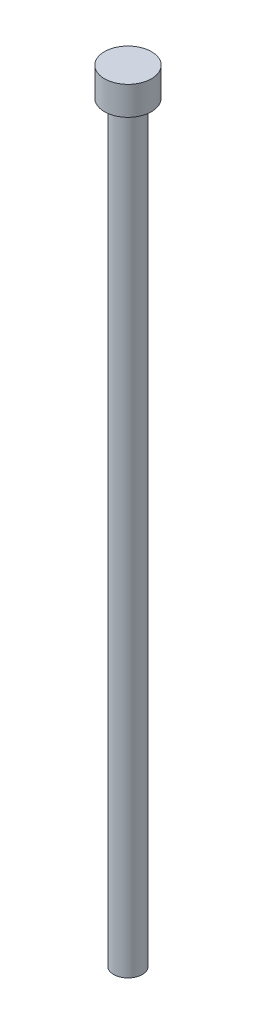
ISO-10303-21;
HEADER;
FILE_DESCRIPTION(('STEP AP214'),'2;1');
FILE_NAME('part.step','',(''),(''),'','','');
FILE_SCHEMA(('AUTOMOTIVE_DESIGN { 1 0 10303 214 1 1 1 1 }'));
ENDSEC;
DATA;
#1=APPLICATION_CONTEXT('core data for automotive mechanical design processes');
#2=APPLICATION_PROTOCOL_DEFINITION('international standard','automotive_design',2000,#1);
#3=PRODUCT_CONTEXT('',#1,'mechanical');
#4=PRODUCT('Part','Part','',(#3));
#5=PRODUCT_RELATED_PRODUCT_CATEGORY('part','',(#4));
#6=PRODUCT_DEFINITION_FORMATION('','',#4);
#7=PRODUCT_DEFINITION_CONTEXT('part definition',#1,'design');
#8=PRODUCT_DEFINITION('design','',#6,#7);
#9=PRODUCT_DEFINITION_SHAPE('','',#8);
#10=(LENGTH_UNIT() NAMED_UNIT(*) SI_UNIT(.MILLI.,.METRE.));
#11=(NAMED_UNIT(*) PLANE_ANGLE_UNIT() SI_UNIT($,.RADIAN.));
#12=(NAMED_UNIT(*) SI_UNIT($,.STERADIAN.) SOLID_ANGLE_UNIT());
#13=UNCERTAINTY_MEASURE_WITH_UNIT(LENGTH_MEASURE(1.E-05),#10,'distance_accuracy_value','');
#14=(GEOMETRIC_REPRESENTATION_CONTEXT(3) GLOBAL_UNCERTAINTY_ASSIGNED_CONTEXT((#13)) GLOBAL_UNIT_ASSIGNED_CONTEXT((#10,
#11,#12)) REPRESENTATION_CONTEXT('',''));
#15=CARTESIAN_POINT('',(0.,0.,0.));
#16=DIRECTION('',(0.,0.,1.));
#17=DIRECTION('',(1.,0.,0.));
#18=AXIS2_PLACEMENT_3D('',#15,#16,#17);
#19=CARTESIAN_POINT('',(0.,4.826,0.));
#20=DIRECTION('',(0.,-1.,0.));
#21=DIRECTION('',(0.,0.,-1.));
#22=AXIS2_PLACEMENT_3D('',#19,#20,#21);
#23=CYLINDRICAL_SURFACE('',#22,3.96875);
#24=CARTESIAN_POINT('',(0.,4.826,0.));
#25=DIRECTION('',(0.,1.,0.));
#26=DIRECTION('',(0.,0.,1.));
#27=AXIS2_PLACEMENT_3D('',#24,#25,#26);
#28=CIRCLE('',#27,3.96875);
#29=CARTESIAN_POINT('',(0.,4.826,3.96875));
#30=VERTEX_POINT('',#29);
#31=EDGE_CURVE('E38',#30,#30,#28,.T.);
#32=ORIENTED_EDGE('',*,*,#31,.F.);
#33=EDGE_LOOP('',(#32));
#34=FACE_BOUND('',#33,.T.);
#35=CARTESIAN_POINT('',(0.,0.,0.));
#36=DIRECTION('',(0.,1.,0.));
#37=DIRECTION('',(0.,0.,1.));
#38=AXIS2_PLACEMENT_3D('',#35,#36,#37);
#39=CIRCLE('',#38,3.96875);
#40=CARTESIAN_POINT('',(0.,0.,3.96875));
#41=VERTEX_POINT('',#40);
#42=EDGE_CURVE('E34',#41,#41,#39,.T.);
#43=ORIENTED_EDGE('',*,*,#42,.T.);
#44=EDGE_LOOP('',(#43));
#45=FACE_BOUND('',#44,.T.);
#46=ADVANCED_FACE('F31',(#34,#45),#23,.T.);
#47=CARTESIAN_POINT('',(0.,4.826,0.));
#48=DIRECTION('',(0.,1.,0.));
#49=DIRECTION('',(0.,0.,1.));
#50=AXIS2_PLACEMENT_3D('',#47,#48,#49);
#51=PLANE('',#50);
#52=ORIENTED_EDGE('',*,*,#31,.T.);
#53=EDGE_LOOP('',(#52));
#54=FACE_BOUND('',#53,.T.);
#55=ADVANCED_FACE('F55',(#54),#51,.T.);
#56=CARTESIAN_POINT('',(0.,0.,0.));
#57=DIRECTION('',(0.,1.,0.));
#58=DIRECTION('',(0.,0.,1.));
#59=AXIS2_PLACEMENT_3D('',#56,#57,#58);
#60=PLANE('',#59);
#61=CARTESIAN_POINT('',(0.,0.,0.));
#62=DIRECTION('',(0.,-1.,0.));
#63=DIRECTION('',(0.,0.,-1.));
#64=AXIS2_PLACEMENT_3D('',#61,#62,#63);
#65=CIRCLE('',#64,2.413);
#66=CARTESIAN_POINT('',(0.,0.,-2.413));
#67=VERTEX_POINT('',#66);
#68=EDGE_CURVE('E10',#67,#67,#65,.T.);
#69=ORIENTED_EDGE('',*,*,#68,.F.);
#70=EDGE_LOOP('',(#69));
#71=FACE_BOUND('',#70,.T.);
#72=ORIENTED_EDGE('',*,*,#42,.F.);
#73=EDGE_LOOP('',(#72));
#74=FACE_BOUND('',#73,.T.);
#75=ADVANCED_FACE('F52',(#71,#74),#60,.F.);
#76=CARTESIAN_POINT('',(0.,-127.,0.));
#77=DIRECTION('',(0.,1.,0.));
#78=DIRECTION('',(0.,0.,1.));
#79=AXIS2_PLACEMENT_3D('',#76,#77,#78);
#80=CYLINDRICAL_SURFACE('',#79,2.413);
#81=CARTESIAN_POINT('',(0.,-127.,0.));
#82=DIRECTION('',(0.,-1.,0.));
#83=DIRECTION('',(0.,0.,-1.));
#84=AXIS2_PLACEMENT_3D('',#81,#82,#83);
#85=CIRCLE('',#84,2.413);
#86=CARTESIAN_POINT('',(0.,-127.,-2.413));
#87=VERTEX_POINT('',#86);
#88=EDGE_CURVE('E44',#87,#87,#85,.T.);
#89=ORIENTED_EDGE('',*,*,#88,.F.);
#90=EDGE_LOOP('',(#89));
#91=FACE_BOUND('',#90,.T.);
#92=ORIENTED_EDGE('',*,*,#68,.T.);
#93=EDGE_LOOP('',(#92));
#94=FACE_BOUND('',#93,.T.);
#95=ADVANCED_FACE('F54',(#91,#94),#80,.T.);
#96=CARTESIAN_POINT('',(0.,-127.,0.));
#97=DIRECTION('',(0.,-1.,0.));
#98=DIRECTION('',(0.,0.,-1.));
#99=AXIS2_PLACEMENT_3D('',#96,#97,#98);
#100=PLANE('',#99);
#101=ORIENTED_EDGE('',*,*,#88,.T.);
#102=EDGE_LOOP('',(#101));
#103=FACE_BOUND('',#102,.T.);
#104=ADVANCED_FACE('F61',(#103),#100,.T.);
#105=CLOSED_SHELL('',(#46,#55,#75,#95,#104));
#106=MANIFOLD_SOLID_BREP('B2',#105);
#107=ADVANCED_BREP_SHAPE_REPRESENTATION('',(#18,#106),#14);
#108=SHAPE_DEFINITION_REPRESENTATION(#9,#107);
ENDSEC;
END-ISO-10303-21;
